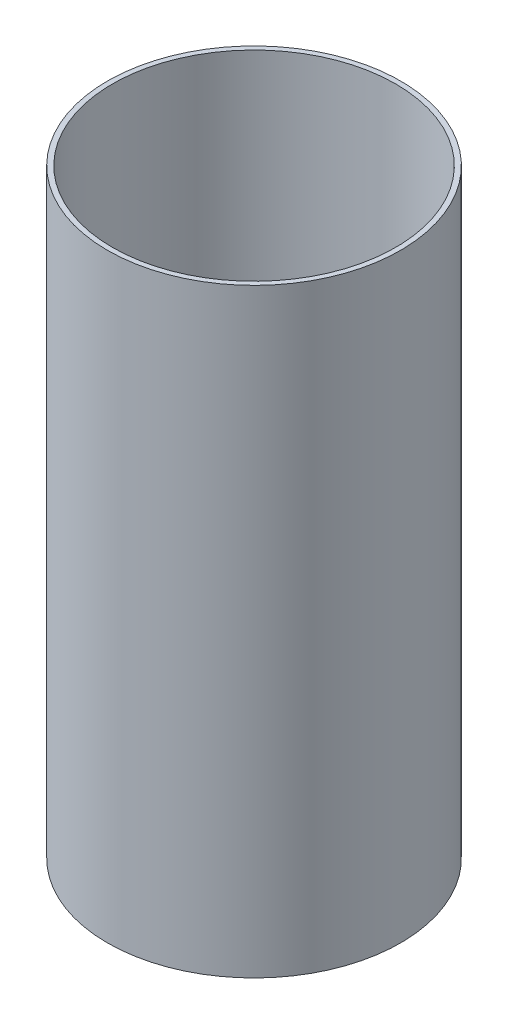
ISO-10303-21;
HEADER;
FILE_DESCRIPTION(('STEP AP214'),'2;1');
FILE_NAME('part.step','',(''),(''),'','','');
FILE_SCHEMA(('AUTOMOTIVE_DESIGN { 1 0 10303 214 1 1 1 1 }'));
ENDSEC;
DATA;
#1=APPLICATION_CONTEXT('core data for automotive mechanical design processes');
#2=APPLICATION_PROTOCOL_DEFINITION('international standard','automotive_design',2000,#1);
#3=PRODUCT_CONTEXT('',#1,'mechanical');
#4=PRODUCT('Part','Part','',(#3));
#5=PRODUCT_RELATED_PRODUCT_CATEGORY('part','',(#4));
#6=PRODUCT_DEFINITION_FORMATION('','',#4);
#7=PRODUCT_DEFINITION_CONTEXT('part definition',#1,'design');
#8=PRODUCT_DEFINITION('design','',#6,#7);
#9=PRODUCT_DEFINITION_SHAPE('','',#8);
#10=(LENGTH_UNIT() NAMED_UNIT(*) SI_UNIT(.MILLI.,.METRE.));
#11=(NAMED_UNIT(*) PLANE_ANGLE_UNIT() SI_UNIT($,.RADIAN.));
#12=(NAMED_UNIT(*) SI_UNIT($,.STERADIAN.) SOLID_ANGLE_UNIT());
#13=UNCERTAINTY_MEASURE_WITH_UNIT(LENGTH_MEASURE(1.E-05),#10,'distance_accuracy_value','');
#14=(GEOMETRIC_REPRESENTATION_CONTEXT(3) GLOBAL_UNCERTAINTY_ASSIGNED_CONTEXT((#13)) GLOBAL_UNIT_ASSIGNED_CONTEXT((#10,
#11,#12)) REPRESENTATION_CONTEXT('',''));
#15=CARTESIAN_POINT('',(0.,0.,0.));
#16=DIRECTION('',(0.,0.,1.));
#17=DIRECTION('',(1.,0.,0.));
#18=AXIS2_PLACEMENT_3D('',#15,#16,#17);
#19=CARTESIAN_POINT('',(0.,360.,0.));
#20=DIRECTION('',(0.,1.,0.));
#21=DIRECTION('',(0.,0.,1.));
#22=AXIS2_PLACEMENT_3D('',#19,#20,#21);
#23=PLANE('',#22);
#24=CARTESIAN_POINT('',(0.,360.,0.));
#25=DIRECTION('',(0.,1.,0.));
#26=DIRECTION('',(0.,0.,1.));
#27=AXIS2_PLACEMENT_3D('',#24,#25,#26);
#28=CIRCLE('',#27,88.);
#29=CARTESIAN_POINT('',(0.,360.,88.));
#30=VERTEX_POINT('',#29);
#31=EDGE_CURVE('E10',#30,#30,#28,.T.);
#32=ORIENTED_EDGE('',*,*,#31,.T.);
#33=EDGE_LOOP('',(#32));
#34=FACE_BOUND('',#33,.T.);
#35=CARTESIAN_POINT('',(0.,360.,0.));
#36=DIRECTION('',(0.,1.,0.));
#37=DIRECTION('',(0.,0.,1.));
#38=AXIS2_PLACEMENT_3D('',#35,#36,#37);
#39=CIRCLE('',#38,85.);
#40=CARTESIAN_POINT('',(0.,360.,85.));
#41=VERTEX_POINT('',#40);
#42=EDGE_CURVE('E56',#41,#41,#39,.T.);
#43=ORIENTED_EDGE('',*,*,#42,.F.);
#44=EDGE_LOOP('',(#43));
#45=FACE_BOUND('',#44,.T.);
#46=ADVANCED_FACE('F40',(#34,#45),#23,.T.);
#47=CARTESIAN_POINT('',(0.,0.,0.));
#48=DIRECTION('',(0.,1.,0.));
#49=DIRECTION('',(0.,0.,1.));
#50=AXIS2_PLACEMENT_3D('',#47,#48,#49);
#51=PLANE('',#50);
#52=CARTESIAN_POINT('',(0.,0.,0.));
#53=DIRECTION('',(0.,1.,0.));
#54=DIRECTION('',(0.,0.,1.));
#55=AXIS2_PLACEMENT_3D('',#52,#53,#54);
#56=CIRCLE('',#55,88.);
#57=CARTESIAN_POINT('',(0.,0.,88.));
#58=VERTEX_POINT('',#57);
#59=EDGE_CURVE('E50',#58,#58,#56,.T.);
#60=ORIENTED_EDGE('',*,*,#59,.F.);
#61=EDGE_LOOP('',(#60));
#62=FACE_BOUND('',#61,.T.);
#63=CARTESIAN_POINT('',(0.,0.,0.));
#64=DIRECTION('',(0.,1.,0.));
#65=DIRECTION('',(0.,0.,1.));
#66=AXIS2_PLACEMENT_3D('',#63,#64,#65);
#67=CIRCLE('',#66,85.);
#68=CARTESIAN_POINT('',(0.,0.,85.));
#69=VERTEX_POINT('',#68);
#70=EDGE_CURVE('E58',#69,#69,#67,.T.);
#71=ORIENTED_EDGE('',*,*,#70,.T.);
#72=EDGE_LOOP('',(#71));
#73=FACE_BOUND('',#72,.T.);
#74=ADVANCED_FACE('F95',(#62,#73),#51,.F.);
#75=CARTESIAN_POINT('',(0.,360.,0.));
#76=DIRECTION('',(0.,-1.,0.));
#77=DIRECTION('',(0.,0.,-1.));
#78=AXIS2_PLACEMENT_3D('',#75,#76,#77);
#79=CYLINDRICAL_SURFACE('',#78,88.);
#80=CARTESIAN_POINT('',(-87.9540429991225,30.9433730848585,-2.84364556661062));
#81=CARTESIAN_POINT('',(-87.9476707610719,31.0893210158754,-3.04073797310525));
#82=CARTESIAN_POINT('',(-87.9409881541693,31.2502143084536,-3.22684535727982));
#83=CARTESIAN_POINT('',(-87.9275980694595,31.5979597516976,-3.57318257927106));
#84=CARTESIAN_POINT('',(-87.9208905745701,31.784835358431,-3.73338874837496));
#85=CARTESIAN_POINT('',(-87.9072128143056,32.205657821541,-4.04339888980558));
#86=CARTESIAN_POINT('',(-87.9003199817605,32.4425672902275,-4.18920518449721));
#87=CARTESIAN_POINT('',(-87.8880074773275,32.937105313504,-4.44004328954576));
#88=CARTESIAN_POINT('',(-87.8825881746412,33.1947390397639,-4.54506488387332));
#89=CARTESIAN_POINT('',(-87.8737014594858,33.7297827083049,-4.71380439839733));
#90=CARTESIAN_POINT('',(-87.8702818784344,34.0075114711242,-4.7765152868226));
#91=CARTESIAN_POINT('',(-87.8659699896812,34.5695264697553,-4.85519169687831));
#92=CARTESIAN_POINT('',(-87.8650778225218,34.8538130693441,-4.87115461898611));
#93=CARTESIAN_POINT('',(-87.8659249734716,35.4250666208069,-4.85585193997417));
#94=CARTESIAN_POINT('',(-87.8677008934206,35.7120161930395,-4.82392943758523));
#95=CARTESIAN_POINT('',(-87.873751950812,36.2764885804653,-4.71240907793311));
#96=CARTESIAN_POINT('',(-87.8780271781186,36.5540110563216,-4.63280950640733));
#97=CARTESIAN_POINT('',(-87.8885863351598,37.0914196999595,-4.42796166181658));
#98=CARTESIAN_POINT('',(-87.8948688272306,37.3513183294581,-4.30274605136547));
#99=CARTESIAN_POINT('',(-87.9087180967348,37.8459397767164,-4.00982423436265));
#100=CARTESIAN_POINT('',(-87.9162847938103,38.0806641682292,-3.84212068612637));
#101=CARTESIAN_POINT('',(-87.9316896044001,38.5142359653303,-3.47155905773461));
#102=CARTESIAN_POINT('',(-87.9395217178024,38.7135816715586,-3.26928418934338));
#103=CARTESIAN_POINT('',(-87.9546451534352,39.074388366518,-2.83334317682413));
#104=CARTESIAN_POINT('',(-87.9619365556862,39.2358549686974,-2.59968169207914));
#105=CARTESIAN_POINT('',(-87.9749296247516,39.51184183569,-2.11403897975569));
#106=CARTESIAN_POINT('',(-87.9806674690627,39.6274663392484,-1.86268633083605));
#107=CARTESIAN_POINT('',(-87.9901214498944,39.8136768319657,-1.3437832693104));
#108=CARTESIAN_POINT('',(-87.9938379183915,39.8842702170472,-1.07623552449843));
#109=CARTESIAN_POINT('',(-87.9987433055361,39.9767807408026,-0.539747233140913));
#110=CARTESIAN_POINT('',(-87.9999931910773,39.9998726108198,-0.271009361190157));
#111=CARTESIAN_POINT('',(-88.0000067505508,40.0001263034008,0.26647608357509));
#112=CARTESIAN_POINT('',(-87.9987706341367,39.9772919990853,0.535223653660359));
#113=CARTESIAN_POINT('',(-87.9939812753194,39.88697769529,1.06204978089256));
#114=CARTESIAN_POINT('',(-87.9904533910443,39.8199861723346,1.32021260709695));
#115=CARTESIAN_POINT('',(-87.9814988225887,39.6440402863453,1.82176672776088));
#116=CARTESIAN_POINT('',(-87.9760720875168,39.5350847986211,2.06515762611059));
#117=CARTESIAN_POINT('',(-87.9638575533789,39.2774655319105,2.53279451345078));
#118=CARTESIAN_POINT('',(-87.9570577066611,39.1284461016146,2.75684404617608));
#119=CARTESIAN_POINT('',(-87.942868160192,38.795722755945,3.17746973808431));
#120=CARTESIAN_POINT('',(-87.9354783973686,38.6120151289449,3.37404295338923));
#121=CARTESIAN_POINT('',(-87.9207198927015,38.2105312749469,3.73915217231865));
#122=CARTESIAN_POINT('',(-87.9133557808625,37.9920521049079,3.90691518857763));
#123=CARTESIAN_POINT('',(-87.8996273887018,37.5306003015463,4.20449338761207));
#124=CARTESIAN_POINT('',(-87.8932632407309,37.287624432928,4.33430354907575));
#125=CARTESIAN_POINT('',(-87.8820657930606,36.7772732426707,4.55578727575959));
#126=CARTESIAN_POINT('',(-87.8772767231128,36.509426994982,4.64637851139099));
#127=CARTESIAN_POINT('',(-87.8699878006873,35.9624454172833,4.78224877357024));
#128=CARTESIAN_POINT('',(-87.8674881947026,35.6833088750927,4.82752292114908));
#129=CARTESIAN_POINT('',(-87.8650288829392,35.1163601363158,4.87208752369437));
#130=CARTESIAN_POINT('',(-87.8651151827836,34.828481956347,4.87054506227753));
#131=CARTESIAN_POINT('',(-87.8679326174765,34.2570189618026,4.81944518087408));
#132=CARTESIAN_POINT('',(-87.8706638836743,33.9734343611568,4.76988537634271));
#133=CARTESIAN_POINT('',(-87.8784799774573,33.41747087823,4.62364600762686));
#134=CARTESIAN_POINT('',(-87.8835742756138,33.1451419347531,4.52677675301075));
#135=CARTESIAN_POINT('',(-87.8955357617886,32.6208861028274,4.28823740157207));
#136=CARTESIAN_POINT('',(-87.9024028974631,32.3689586123062,4.14656862744501));
#137=CARTESIAN_POINT('',(-87.91702720645,31.8957807729457,3.82387697704638));
#138=CARTESIAN_POINT('',(-87.9247737590414,31.6742234736523,3.64330411268027));
#139=CARTESIAN_POINT('',(-87.9403102878202,31.26548829027,3.24670410801203));
#140=CARTESIAN_POINT('',(-87.9481002585019,31.0783061449353,3.03068136847639));
#141=CARTESIAN_POINT('',(-87.9626163552069,30.7484121490387,2.57465659566015));
#142=CARTESIAN_POINT('',(-87.9693631224229,30.604761538195,2.33533458278119));
#143=CARTESIAN_POINT('',(-87.9812111303287,30.3609422659886,1.83544714474664));
#144=CARTESIAN_POINT('',(-87.9863126930349,30.2607650942291,1.57488588927683));
#145=CARTESIAN_POINT('',(-87.9941503929795,30.1094356594656,1.04745363720884));
#146=CARTESIAN_POINT('',(-87.9969464231246,30.0570380650666,0.780940475213845));
#147=CARTESIAN_POINT('',(-88.0000759869122,29.9984984367008,0.242828442558164));
#148=CARTESIAN_POINT('',(-88.0004094096921,29.9923584851769,-0.0287706565112488));
#149=CARTESIAN_POINT('',(-87.9985903886024,30.0262624468126,-0.564598386482136));
#150=CARTESIAN_POINT('',(-87.9964781437417,30.06555950526,-0.828875131554263));
#151=CARTESIAN_POINT('',(-87.9900718945376,30.1878012761286,-1.34694787390808));
#152=CARTESIAN_POINT('',(-87.9857796120362,30.2707115437133,-1.60075197192378));
#153=CARTESIAN_POINT('',(-87.9769292428817,30.4485894853842,-2.02272616883806));
#154=CARTESIAN_POINT('',(-87.9727764097144,30.5338055629249,-2.19509515197303));
#155=CARTESIAN_POINT('',(-87.9638266371527,30.7240910422377,-2.52843195736484));
#156=CARTESIAN_POINT('',(-87.9590298608459,30.8291554198851,-2.68940265068206));
#157=CARTESIAN_POINT('',(-87.9540429991225,30.9433730848585,-2.84364556661062));
#158=B_SPLINE_CURVE_WITH_KNOTS('',3,(#80,#81,#82,#83,#84,#85,#86,#87,#88,#89,#90,#91,#92,#93,
#94,#95,#96,#97,#98,#99,#100,#101,#102,#103,#104,#105,#106,#107,#108,#109,#110,#111,#112,#113,
#114,#115,#116,#117,#118,#119,#120,#121,#122,#123,#124,#125,#126,#127,#128,#129,#130,#131,#132,
#133,#134,#135,#136,#137,#138,#139,#140,#141,#142,#143,#144,#145,#146,#147,#148,#149,#150,#151,
#152,#153,#154,#155,#156,#157),.UNSPECIFIED.,.T.,.F.,(4,2,2,2,2,2,2,2,2,2,2,2,2,2,2,2,2,2,2,2,2,
2,2,2,2,2,2,2,2,2,2,2,2,2,2,2,2,2,4),(0.,0.735430634568947,1.47152955806588,2.30244007514412,
3.13355859030393,3.98381968694934,4.83412806332001,5.69620829076534,6.55831951677328,
7.41981465164991,8.28125589922084,9.12938696141466,9.97739225633658,10.8035079926258,
11.6294880124941,12.4347829254938,13.2400099279028,14.0364755545876,14.8329625291026,
15.6367678261957,16.4406591789939,17.2635616899653,18.0865730249553,18.931038134093,
19.7755941510154,20.6351843650862,21.4948172686577,22.3579255823219,23.2210084152906,
24.0745978479833,24.9280813956758,25.761577919419,26.5949112035024,27.4058459535542,
28.2168172103329,29.014645662989,29.8118449507151,30.3875325167146,30.963074555886),.UNSPECIFIED.);
#159=CARTESIAN_POINT('',(-87.9540429991225,30.9433730848585,-2.84364556661062));
#160=VERTEX_POINT('',#159);
#161=EDGE_CURVE('E74',#160,#160,#158,.T.);
#162=ORIENTED_EDGE('',*,*,#161,.T.);
#163=EDGE_LOOP('',(#162));
#164=FACE_BOUND('',#163,.T.);
#165=ORIENTED_EDGE('',*,*,#31,.F.);
#166=EDGE_LOOP('',(#165));
#167=FACE_BOUND('',#166,.T.);
#168=ORIENTED_EDGE('',*,*,#59,.T.);
#169=EDGE_LOOP('',(#168));
#170=FACE_BOUND('',#169,.T.);
#171=ADVANCED_FACE('F42',(#164,#167,#170),#79,.T.);
#172=CARTESIAN_POINT('',(0.,360.,0.));
#173=DIRECTION('',(0.,-1.,0.));
#174=DIRECTION('',(0.,0.,-1.));
#175=AXIS2_PLACEMENT_3D('',#172,#173,#174);
#176=CYLINDRICAL_SURFACE('',#175,85.);
#177=CARTESIAN_POINT('',(-84.9555030589544,35.,2.75));
#178=CARTESIAN_POINT('',(-84.9555036591075,35.1544253316474,2.74999316515209));
#179=CARTESIAN_POINT('',(-84.955928635186,35.3089616074148,2.73694878178158));
#180=CARTESIAN_POINT('',(-84.9575830207067,35.613775173835,2.6850948299683));
#181=CARTESIAN_POINT('',(-84.9588133898274,35.7640471601517,2.64625452318937));
#182=CARTESIAN_POINT('',(-84.9619390409373,36.0558722444831,2.5439182462736));
#183=CARTESIAN_POINT('',(-84.9638339963475,36.1974295848009,2.48043438439227));
#184=CARTESIAN_POINT('',(-84.9680748795493,36.4678385422615,2.33063055076777));
#185=CARTESIAN_POINT('',(-84.9704206975493,36.596693241144,2.24431613666702));
#186=CARTESIAN_POINT('',(-84.9753003649316,36.8381440872069,2.05125047683989));
#187=CARTESIAN_POINT('',(-84.9778342950401,36.9507331924054,1.94449042567524));
#188=CARTESIAN_POINT('',(-84.9828038608134,37.1563974755755,1.7135797863632));
#189=CARTESIAN_POINT('',(-84.9852394925519,37.2494718746815,1.58942850443153));
#190=CARTESIAN_POINT('',(-84.9897383547577,37.4134772140428,1.32723153692301));
#191=CARTESIAN_POINT('',(-84.9918015103795,37.4844037059715,1.18918306749972));
#192=CARTESIAN_POINT('',(-84.9953221935639,37.6020710197008,0.903130213320748));
#193=CARTESIAN_POINT('',(-84.9967797237516,37.6488119463393,0.755125871724191));
#194=CARTESIAN_POINT('',(-84.9989244046218,37.7167655708407,0.453417842884322));
#195=CARTESIAN_POINT('',(-84.9996118269163,37.7379872693646,0.299716184819147));
#196=CARTESIAN_POINT('',(-85.0001397154481,37.7543277676202,-0.00906943270984609));
#197=CARTESIAN_POINT('',(-84.9999801853658,37.7494466807777,-0.164153386164178));
#198=CARTESIAN_POINT('',(-84.9988323833846,37.7137277435168,-0.471240360256295));
#199=CARTESIAN_POINT('',(-84.9978444215801,37.6828996054483,-0.623244511908722));
#200=CARTESIAN_POINT('',(-84.995151453428,37.5961766923128,-0.919918941007912));
#201=CARTESIAN_POINT('',(-84.9934464453727,37.5402818575416,-1.06458920098582));
#202=CARTESIAN_POINT('',(-84.9895110039505,37.4050010676239,-1.34252043319086));
#203=CARTESIAN_POINT('',(-84.9872804711034,37.3256106641033,-1.47577923874216));
#204=CARTESIAN_POINT('',(-84.9825453387706,37.1455956414258,-1.72708107251055));
#205=CARTESIAN_POINT('',(-84.9800407385385,37.0449709644339,-1.8451240592834));
#206=CARTESIAN_POINT('',(-84.9750383577041,36.8252887924754,-2.06270006917716));
#207=CARTESIAN_POINT('',(-84.9725405807535,36.7062228703058,-2.16222458380177));
#208=CARTESIAN_POINT('',(-84.9678346023805,36.453067771618,-2.33987299842062));
#209=CARTESIAN_POINT('',(-84.9656264010077,36.3189785925197,-2.41799689473949));
#210=CARTESIAN_POINT('',(-84.9617486491887,36.039578476868,-2.55062550492446));
#211=CARTESIAN_POINT('',(-84.9600791051245,35.8942674073822,-2.60512993894804));
#212=CARTESIAN_POINT('',(-84.9574671879042,35.5965505591424,-2.68896694255014));
#213=CARTESIAN_POINT('',(-84.9565248124469,35.4441448028433,-2.71829959179209));
#214=CARTESIAN_POINT('',(-84.9554739094406,35.1366388719887,-2.75094992966132));
#215=CARTESIAN_POINT('',(-84.955365004007,34.9815399504528,-2.75427940780937));
#216=CARTESIAN_POINT('',(-84.9559923350124,34.6729853748952,-2.73485961841088));
#217=CARTESIAN_POINT('',(-84.9567285703058,34.5195297186466,-2.71211038621101));
#218=CARTESIAN_POINT('',(-84.9589628439366,34.2186506526173,-2.64118871112575));
#219=CARTESIAN_POINT('',(-84.9604607216244,34.0712259778336,-2.59302162942094));
#220=CARTESIAN_POINT('',(-84.9640492905023,33.7865548852355,-2.47263698218798));
#221=CARTESIAN_POINT('',(-84.9661399830914,33.6493084914417,-2.40041935990286));
#222=CARTESIAN_POINT('',(-84.9706794246433,33.3888355974389,-2.23395325835704));
#223=CARTESIAN_POINT('',(-84.9731283025051,33.265614172853,-2.13969684073052));
#224=CARTESIAN_POINT('',(-84.9781075992919,33.0367400181476,-1.93184039613588));
#225=CARTESIAN_POINT('',(-84.9806380184537,32.9310873390412,-1.81824031300302));
#226=CARTESIAN_POINT('',(-84.9854962478801,32.740310408103,-1.57487072846735));
#227=CARTESIAN_POINT('',(-84.9878239828943,32.6551937600825,-1.44509526474843));
#228=CARTESIAN_POINT('',(-84.9920133810316,32.5079570321766,-1.17308917137832));
#229=CARTESIAN_POINT('',(-84.9938750452951,32.4458368960286,-1.03085857220061));
#230=CARTESIAN_POINT('',(-84.9969220884904,32.3463698887151,-0.73800824813861));
#231=CARTESIAN_POINT('',(-84.9981076017422,32.3090180969859,-0.587390195983102));
#232=CARTESIAN_POINT('',(-84.999669241054,32.2601319242197,-0.282016790317891));
#233=CARTESIAN_POINT('',(-85.0000453681762,32.2485975093024,-0.127261442237878));
#234=CARTESIAN_POINT('',(-84.9999458456503,32.2516740699728,0.181917669603897));
#235=CARTESIAN_POINT('',(-84.9994705860573,32.2662730727701,0.336341552773687));
#236=CARTESIAN_POINT('',(-84.9977226031328,32.3211774169008,0.640545236079515));
#237=CARTESIAN_POINT('',(-84.9964498782281,32.3614828089462,0.790325027053332));
#238=CARTESIAN_POINT('',(-84.9932503061652,32.4666540084749,1.08099301665229));
#239=CARTESIAN_POINT('',(-84.9913234484385,32.5315202127827,1.22188107157233));
#240=CARTESIAN_POINT('',(-84.9870326818255,32.6839680320098,1.49076473360223));
#241=CARTESIAN_POINT('',(-84.984668788526,32.7715488368693,1.61876080024693));
#242=CARTESIAN_POINT('',(-84.9797691539158,32.9669766445606,1.85828319306133));
#243=CARTESIAN_POINT('',(-84.9772333525039,33.0748307587911,1.96980371540879));
#244=CARTESIAN_POINT('',(-84.9722757243801,33.307761957591,2.17318609196205));
#245=CARTESIAN_POINT('',(-84.9698539260285,33.4328432976946,2.265043074441));
#246=CARTESIAN_POINT('',(-84.965396505309,33.6967317940492,2.42650900045165));
#247=CARTESIAN_POINT('',(-84.9633611453495,33.8355481803811,2.49610284815942));
#248=CARTESIAN_POINT('',(-84.9599108465497,34.1227945496396,2.61091542943885));
#249=CARTESIAN_POINT('',(-84.9584951688921,34.2712128409019,2.65616320450646));
#250=CARTESIAN_POINT('',(-84.9568219709372,34.5171393965779,2.70901935221037));
#251=CARTESIAN_POINT('',(-84.9563295306816,34.613051692212,2.72436773243313));
#252=CARTESIAN_POINT('',(-84.9556698861775,34.8059613885993,2.74486020208665));
#253=CARTESIAN_POINT('',(-84.9555026818169,34.9029587889785,2.75000429503315));
#254=CARTESIAN_POINT('',(-84.9555030589544,35.,2.75));
#255=B_SPLINE_CURVE_WITH_KNOTS('',3,(#177,#178,#179,#180,#181,#182,#183,#184,#185,#186,#187,
#188,#189,#190,#191,#192,#193,#194,#195,#196,#197,#198,#199,#200,#201,#202,#203,#204,#205,#206,
#207,#208,#209,#210,#211,#212,#213,#214,#215,#216,#217,#218,#219,#220,#221,#222,#223,#224,#225,
#226,#227,#228,#229,#230,#231,#232,#233,#234,#235,#236,#237,#238,#239,#240,#241,#242,#243,#244,
#245,#246,#247,#248,#249,#250,#251,#252,#253,#254),.UNSPECIFIED.,.T.,.F.,(4,2,2,2,2,2,2,2,2,2,2,
2,2,2,2,2,2,2,2,2,2,2,2,2,2,2,2,2,2,2,2,2,2,2,2,2,2,2,4),(0.,0.462921779554308,
0.926396167220446,1.38964312107365,1.85277741031643,2.3161116106142,2.77946429986131,
3.24290999204247,3.70635367529674,4.1696338534467,4.63291201848202,5.09601684899882,
5.55912278254931,6.02231645127099,6.48551138159423,6.94891860874135,7.41232591547439,
7.87573871249006,8.33915004289571,8.80235125604971,9.26555184138893,9.72865476661746,
10.1917587847321,10.655029870415,11.1183023012383,11.5817460041336,12.0451885731715,
12.5085390455259,12.9718889098199,13.4350265488644,13.8981651015642,14.3613111374301,
14.8244406586122,15.2877329388967,15.7511398693362,16.2148603564358,16.6780264558869,
16.9689275994647,17.2598286428166),.UNSPECIFIED.);
#256=CARTESIAN_POINT('',(-84.9555030589544,35.,2.75));
#257=VERTEX_POINT('',#256);
#258=EDGE_CURVE('E62',#257,#257,#255,.T.);
#259=ORIENTED_EDGE('',*,*,#258,.T.);
#260=EDGE_LOOP('',(#259));
#261=FACE_BOUND('',#260,.T.);
#262=ORIENTED_EDGE('',*,*,#42,.T.);
#263=EDGE_LOOP('',(#262));
#264=FACE_BOUND('',#263,.T.);
#265=ORIENTED_EDGE('',*,*,#70,.F.);
#266=EDGE_LOOP('',(#265));
#267=FACE_BOUND('',#266,.T.);
#268=ADVANCED_FACE('F90',(#261,#264,#267),#176,.F.);
#269=CARTESIAN_POINT('',(88.001,35.,0.));
#270=DIRECTION('',(-1.,0.,0.));
#271=DIRECTION('',(0.,0.,1.));
#272=AXIS2_PLACEMENT_3D('',#269,#270,#271);
#273=CYLINDRICAL_SURFACE('',#272,2.75);
#274=CARTESIAN_POINT('',(-85.7500000000001,35.,0.));
#275=DIRECTION('',(-1.,0.,0.));
#276=DIRECTION('',(0.,0.,1.));
#277=AXIS2_PLACEMENT_3D('',#274,#275,#276);
#278=CIRCLE('',#277,2.75);
#279=CARTESIAN_POINT('',(-85.7500000000001,35.,2.74999999999999));
#280=VERTEX_POINT('',#279);
#281=EDGE_CURVE('E45',#280,#280,#278,.T.);
#282=ORIENTED_EDGE('',*,*,#281,.T.);
#283=EDGE_LOOP('',(#282));
#284=FACE_BOUND('',#283,.T.);
#285=ORIENTED_EDGE('',*,*,#258,.F.);
#286=EDGE_LOOP('',(#285));
#287=FACE_BOUND('',#286,.T.);
#288=ADVANCED_FACE('F79',(#284,#287),#273,.F.);
#289=CARTESIAN_POINT('',(-88.,35.,0.));
#290=DIRECTION('',(-1.,0.,0.));
#291=DIRECTION('',(0.,0.,1.));
#292=AXIS2_PLACEMENT_3D('',#289,#290,#291);
#293=CONICAL_SURFACE('',#292,4.99999999999999,0.785398163397468);
#294=ORIENTED_EDGE('',*,*,#281,.F.);
#295=EDGE_LOOP('',(#294));
#296=FACE_BOUND('',#295,.T.);
#297=ORIENTED_EDGE('',*,*,#161,.F.);
#298=EDGE_LOOP('',(#297));
#299=FACE_BOUND('',#298,.T.);
#300=ADVANCED_FACE('F83',(#296,#299),#293,.F.);
#301=CLOSED_SHELL('',(#46,#74,#171,#268,#288,#300));
#302=MANIFOLD_SOLID_BREP('B2',#301);
#303=ADVANCED_BREP_SHAPE_REPRESENTATION('',(#18,#302),#14);
#304=SHAPE_DEFINITION_REPRESENTATION(#9,#303);
ENDSEC;
END-ISO-10303-21;
